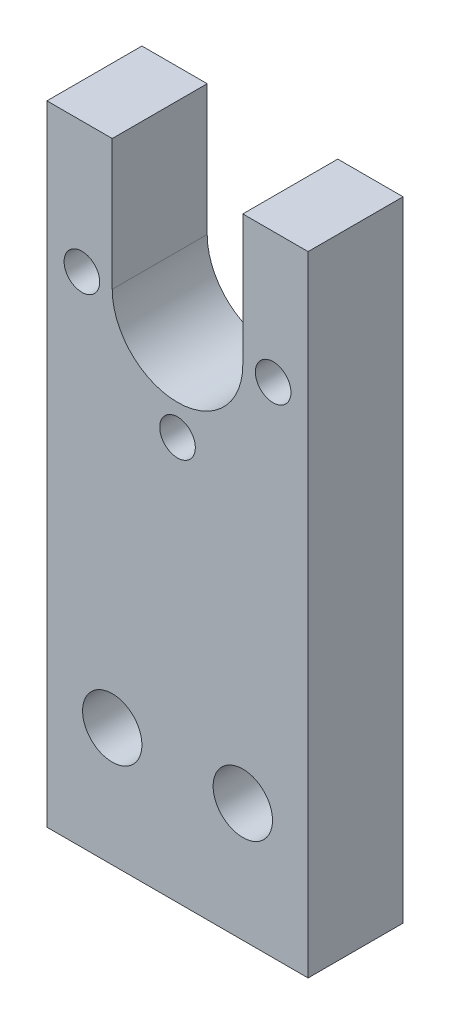
ISO-10303-21;
HEADER;
FILE_DESCRIPTION(('STEP AP214'),'2;1');
FILE_NAME('part.step','',(''),(''),'','','');
FILE_SCHEMA(('AUTOMOTIVE_DESIGN { 1 0 10303 214 1 1 1 1 }'));
ENDSEC;
DATA;
#1=APPLICATION_CONTEXT('core data for automotive mechanical design processes');
#2=APPLICATION_PROTOCOL_DEFINITION('international standard','automotive_design',2000,#1);
#3=PRODUCT_CONTEXT('',#1,'mechanical');
#4=PRODUCT('Part','Part','',(#3));
#5=PRODUCT_RELATED_PRODUCT_CATEGORY('part','',(#4));
#6=PRODUCT_DEFINITION_FORMATION('','',#4);
#7=PRODUCT_DEFINITION_CONTEXT('part definition',#1,'design');
#8=PRODUCT_DEFINITION('design','',#6,#7);
#9=PRODUCT_DEFINITION_SHAPE('','',#8);
#10=(LENGTH_UNIT() NAMED_UNIT(*) SI_UNIT(.MILLI.,.METRE.));
#11=(NAMED_UNIT(*) PLANE_ANGLE_UNIT() SI_UNIT($,.RADIAN.));
#12=(NAMED_UNIT(*) SI_UNIT($,.STERADIAN.) SOLID_ANGLE_UNIT());
#13=UNCERTAINTY_MEASURE_WITH_UNIT(LENGTH_MEASURE(1.E-05),#10,'distance_accuracy_value','');
#14=(GEOMETRIC_REPRESENTATION_CONTEXT(3) GLOBAL_UNCERTAINTY_ASSIGNED_CONTEXT((#13)) GLOBAL_UNIT_ASSIGNED_CONTEXT((#10,
#11,#12)) REPRESENTATION_CONTEXT('',''));
#15=CARTESIAN_POINT('',(0.,0.,0.));
#16=DIRECTION('',(0.,0.,1.));
#17=DIRECTION('',(1.,0.,0.));
#18=AXIS2_PLACEMENT_3D('',#15,#16,#17);
#19=CARTESIAN_POINT('',(-18.0088495575221,23.8008849557522,8.));
#20=DIRECTION('',(0.,-1.,0.));
#21=DIRECTION('',(0.,0.,-1.));
#22=AXIS2_PLACEMENT_3D('',#19,#20,#21);
#23=PLANE('',#22);
#24=DIRECTION('',(-1.,0.,0.));
#25=VECTOR('',#24,1.);
#26=CARTESIAN_POINT('',(-18.0088495575221,23.8008849557522,8.));
#27=LINE('',#26,#25);
#28=CARTESIAN_POINT('',(-12.5088495575221,23.8008849557522,8.));
#29=VERTEX_POINT('',#28);
#30=CARTESIAN_POINT('',(-18.0088495575221,23.8008849557522,8.));
#31=VERTEX_POINT('',#30);
#32=EDGE_CURVE('E136',#29,#31,#27,.T.);
#33=ORIENTED_EDGE('',*,*,#32,.F.);
#34=DIRECTION('',(0.,0.,1.));
#35=VECTOR('',#34,1.);
#36=CARTESIAN_POINT('',(-12.5088495575221,23.8008849557522,-2.));
#37=LINE('',#36,#35);
#38=CARTESIAN_POINT('',(-12.5088495575221,23.8008849557522,0.));
#39=VERTEX_POINT('',#38);
#40=EDGE_CURVE('E177',#39,#29,#37,.T.);
#41=ORIENTED_EDGE('',*,*,#40,.F.);
#42=DIRECTION('',(-1.,0.,0.));
#43=VECTOR('',#42,1.);
#44=CARTESIAN_POINT('',(-18.0088495575221,23.8008849557522,0.));
#45=LINE('',#44,#43);
#46=CARTESIAN_POINT('',(-18.0088495575221,23.8008849557522,0.));
#47=VERTEX_POINT('',#46);
#48=EDGE_CURVE('E146',#39,#47,#45,.T.);
#49=ORIENTED_EDGE('',*,*,#48,.T.);
#50=DIRECTION('',(0.,0.,-1.));
#51=VECTOR('',#50,1.);
#52=CARTESIAN_POINT('',(-18.0088495575221,23.8008849557522,8.));
#53=LINE('',#52,#51);
#54=EDGE_CURVE('E158',#31,#47,#53,.T.);
#55=ORIENTED_EDGE('',*,*,#54,.F.);
#56=EDGE_LOOP('',(#33,#41,#49,#55));
#57=FACE_BOUND('',#56,.T.);
#58=ADVANCED_FACE('F33',(#57),#23,.F.);
#59=CARTESIAN_POINT('',(0.,0.,8.));
#60=DIRECTION('',(0.,0.,1.));
#61=DIRECTION('',(1.,0.,0.));
#62=AXIS2_PLACEMENT_3D('',#59,#60,#61);
#63=PLANE('',#62);
#64=DIRECTION('',(0.,-1.,0.));
#65=VECTOR('',#64,1.);
#66=CARTESIAN_POINT('',(-12.5088495575221,12.8008849557522,8.));
#67=LINE('',#66,#65);
#68=CARTESIAN_POINT('',(-12.5088495575221,12.8008849557522,8.));
#69=VERTEX_POINT('',#68);
#70=EDGE_CURVE('E55',#29,#69,#67,.T.);
#71=ORIENTED_EDGE('',*,*,#70,.F.);
#72=ORIENTED_EDGE('',*,*,#32,.T.);
#73=DIRECTION('',(0.,-1.,0.));
#74=VECTOR('',#73,1.);
#75=CARTESIAN_POINT('',(-18.0088495575221,23.8008849557522,8.));
#76=LINE('',#75,#74);
#77=CARTESIAN_POINT('',(-18.0088495575221,-29.1991150442478,8.));
#78=VERTEX_POINT('',#77);
#79=EDGE_CURVE('E139',#31,#78,#76,.T.);
#80=ORIENTED_EDGE('',*,*,#79,.T.);
#81=DIRECTION('',(1.,0.,0.));
#82=VECTOR('',#81,1.);
#83=CARTESIAN_POINT('',(-18.0088495575221,-29.1991150442478,8.));
#84=LINE('',#83,#82);
#85=CARTESIAN_POINT('',(3.99115044247788,-29.1991150442478,8.));
#86=VERTEX_POINT('',#85);
#87=EDGE_CURVE('E141',#78,#86,#84,.T.);
#88=ORIENTED_EDGE('',*,*,#87,.T.);
#89=DIRECTION('',(0.,1.,0.));
#90=VECTOR('',#89,1.);
#91=CARTESIAN_POINT('',(3.99115044247787,23.8008849557522,8.));
#92=LINE('',#91,#90);
#93=CARTESIAN_POINT('',(3.99115044247787,23.8008849557522,8.));
#94=VERTEX_POINT('',#93);
#95=EDGE_CURVE('E134',#86,#94,#92,.T.);
#96=ORIENTED_EDGE('',*,*,#95,.T.);
#97=CARTESIAN_POINT('',(-1.50884955752212,23.8008849557522,8.));
#98=VERTEX_POINT('',#97);
#99=EDGE_CURVE('E110',#94,#98,#27,.T.);
#100=ORIENTED_EDGE('',*,*,#99,.T.);
#101=DIRECTION('',(0.,1.,0.));
#102=VECTOR('',#101,1.);
#103=CARTESIAN_POINT('',(-1.50884955752212,23.8008849557522,8.));
#104=LINE('',#103,#102);
#105=CARTESIAN_POINT('',(-1.50884955752212,12.8008849557522,8.));
#106=VERTEX_POINT('',#105);
#107=EDGE_CURVE('E96',#106,#98,#104,.T.);
#108=ORIENTED_EDGE('',*,*,#107,.F.);
#109=CARTESIAN_POINT('',(-7.00884955752212,12.8008849557522,8.));
#110=DIRECTION('',(0.,0.,1.));
#111=DIRECTION('',(1.,0.,0.));
#112=AXIS2_PLACEMENT_3D('',#109,#110,#111);
#113=CIRCLE('',#112,5.5);
#114=EDGE_CURVE('E108',#69,#106,#113,.T.);
#115=ORIENTED_EDGE('',*,*,#114,.F.);
#116=EDGE_LOOP('',(#71,#72,#80,#88,#96,#100,#108,#115));
#117=FACE_BOUND('',#116,.T.);
#118=CARTESIAN_POINT('',(-7.00884955752212,4.74282834419709,8.));
#119=DIRECTION('',(0.,0.,1.));
#120=DIRECTION('',(1.,0.,0.));
#121=AXIS2_PLACEMENT_3D('',#118,#119,#120);
#122=CIRCLE('',#121,1.5);
#123=CARTESIAN_POINT('',(-5.50884955752212,4.74282834419709,8.));
#124=VERTEX_POINT('',#123);
#125=EDGE_CURVE('E191',#124,#124,#122,.T.);
#126=ORIENTED_EDGE('',*,*,#125,.F.);
#127=EDGE_LOOP('',(#126));
#128=FACE_BOUND('',#127,.T.);
#129=CARTESIAN_POINT('',(-1.50884955752212,-19.1991150442478,8.));
#130=DIRECTION('',(0.,0.,1.));
#131=DIRECTION('',(1.,0.,0.));
#132=AXIS2_PLACEMENT_3D('',#129,#130,#131);
#133=CIRCLE('',#132,2.5);
#134=CARTESIAN_POINT('',(0.99115044247788,-19.1991150442478,8.));
#135=VERTEX_POINT('',#134);
#136=EDGE_CURVE('E117',#135,#135,#133,.T.);
#137=ORIENTED_EDGE('',*,*,#136,.F.);
#138=EDGE_LOOP('',(#137));
#139=FACE_BOUND('',#138,.T.);
#140=CARTESIAN_POINT('',(-12.5088495575221,-19.1991150442478,8.));
#141=DIRECTION('',(0.,0.,1.));
#142=DIRECTION('',(1.,0.,0.));
#143=AXIS2_PLACEMENT_3D('',#140,#141,#142);
#144=CIRCLE('',#143,2.5);
#145=CARTESIAN_POINT('',(-10.0088495575221,-19.1991150442478,8.));
#146=VERTEX_POINT('',#145);
#147=EDGE_CURVE('E128',#146,#146,#144,.T.);
#148=ORIENTED_EDGE('',*,*,#147,.F.);
#149=EDGE_LOOP('',(#148));
#150=FACE_BOUND('',#149,.T.);
#151=CARTESIAN_POINT('',(1.04920705403299,12.8008849557522,8.));
#152=DIRECTION('',(0.,0.,1.));
#153=DIRECTION('',(1.,0.,0.));
#154=AXIS2_PLACEMENT_3D('',#151,#152,#153);
#155=CIRCLE('',#154,1.5);
#156=CARTESIAN_POINT('',(2.54920705403299,12.8008849557522,8.));
#157=VERTEX_POINT('',#156);
#158=EDGE_CURVE('E119',#157,#157,#155,.T.);
#159=ORIENTED_EDGE('',*,*,#158,.F.);
#160=EDGE_LOOP('',(#159));
#161=FACE_BOUND('',#160,.T.);
#162=CARTESIAN_POINT('',(-15.0669061690772,12.8008849557522,8.));
#163=DIRECTION('',(0.,0.,1.));
#164=DIRECTION('',(1.,0.,0.));
#165=AXIS2_PLACEMENT_3D('',#162,#163,#164);
#166=CIRCLE('',#165,1.5);
#167=CARTESIAN_POINT('',(-13.5669061690772,12.8008849557522,8.));
#168=VERTEX_POINT('',#167);
#169=EDGE_CURVE('E185',#168,#168,#166,.T.);
#170=ORIENTED_EDGE('',*,*,#169,.F.);
#171=EDGE_LOOP('',(#170));
#172=FACE_BOUND('',#171,.T.);
#173=ADVANCED_FACE('F106',(#117,#128,#139,#150,#161,#172),#63,.T.);
#174=CARTESIAN_POINT('',(0.,0.,0.));
#175=DIRECTION('',(0.,0.,1.));
#176=DIRECTION('',(1.,0.,0.));
#177=AXIS2_PLACEMENT_3D('',#174,#175,#176);
#178=PLANE('',#177);
#179=CARTESIAN_POINT('',(-12.5088495575221,-19.1991150442478,0.));
#180=DIRECTION('',(0.,0.,1.));
#181=DIRECTION('',(1.,0.,0.));
#182=AXIS2_PLACEMENT_3D('',#179,#180,#181);
#183=CIRCLE('',#182,2.5);
#184=CARTESIAN_POINT('',(-10.0088495575221,-19.1991150442478,0.));
#185=VERTEX_POINT('',#184);
#186=EDGE_CURVE('E126',#185,#185,#183,.T.);
#187=ORIENTED_EDGE('',*,*,#186,.T.);
#188=EDGE_LOOP('',(#187));
#189=FACE_BOUND('',#188,.T.);
#190=CARTESIAN_POINT('',(-1.50884955752212,-19.1991150442478,0.));
#191=DIRECTION('',(0.,0.,1.));
#192=DIRECTION('',(1.,0.,0.));
#193=AXIS2_PLACEMENT_3D('',#190,#191,#192);
#194=CIRCLE('',#193,2.5);
#195=CARTESIAN_POINT('',(0.99115044247788,-19.1991150442478,0.));
#196=VERTEX_POINT('',#195);
#197=EDGE_CURVE('E113',#196,#196,#194,.T.);
#198=ORIENTED_EDGE('',*,*,#197,.T.);
#199=EDGE_LOOP('',(#198));
#200=FACE_BOUND('',#199,.T.);
#201=ORIENTED_EDGE('',*,*,#48,.F.);
#202=DIRECTION('',(0.,-1.,0.));
#203=VECTOR('',#202,1.);
#204=CARTESIAN_POINT('',(-12.5088495575221,0.,0.));
#205=LINE('',#204,#203);
#206=CARTESIAN_POINT('',(-12.5088495575221,12.8008849557522,0.));
#207=VERTEX_POINT('',#206);
#208=EDGE_CURVE('E176',#39,#207,#205,.T.);
#209=ORIENTED_EDGE('',*,*,#208,.T.);
#210=CARTESIAN_POINT('',(-7.00884955752212,12.8008849557522,0.));
#211=DIRECTION('',(0.,0.,1.));
#212=DIRECTION('',(1.,0.,0.));
#213=AXIS2_PLACEMENT_3D('',#210,#211,#212);
#214=CIRCLE('',#213,5.5);
#215=CARTESIAN_POINT('',(-1.50884955752212,12.8008849557522,0.));
#216=VERTEX_POINT('',#215);
#217=EDGE_CURVE('E114',#207,#216,#214,.T.);
#218=ORIENTED_EDGE('',*,*,#217,.T.);
#219=DIRECTION('',(0.,1.,0.));
#220=VECTOR('',#219,1.);
#221=CARTESIAN_POINT('',(-1.50884955752212,0.,0.));
#222=LINE('',#221,#220);
#223=CARTESIAN_POINT('',(-1.50884955752212,23.8008849557522,0.));
#224=VERTEX_POINT('',#223);
#225=EDGE_CURVE('E48',#216,#224,#222,.T.);
#226=ORIENTED_EDGE('',*,*,#225,.T.);
#227=CARTESIAN_POINT('',(3.99115044247787,23.8008849557522,0.));
#228=VERTEX_POINT('',#227);
#229=EDGE_CURVE('E147',#228,#224,#45,.T.);
#230=ORIENTED_EDGE('',*,*,#229,.F.);
#231=DIRECTION('',(0.,1.,0.));
#232=VECTOR('',#231,1.);
#233=CARTESIAN_POINT('',(3.99115044247787,23.8008849557522,0.));
#234=LINE('',#233,#232);
#235=CARTESIAN_POINT('',(3.99115044247788,-29.1991150442478,0.));
#236=VERTEX_POINT('',#235);
#237=EDGE_CURVE('E131',#236,#228,#234,.T.);
#238=ORIENTED_EDGE('',*,*,#237,.F.);
#239=DIRECTION('',(1.,0.,0.));
#240=VECTOR('',#239,1.);
#241=CARTESIAN_POINT('',(-18.0088495575221,-29.1991150442478,0.));
#242=LINE('',#241,#240);
#243=CARTESIAN_POINT('',(-18.0088495575221,-29.1991150442478,0.));
#244=VERTEX_POINT('',#243);
#245=EDGE_CURVE('E137',#244,#236,#242,.T.);
#246=ORIENTED_EDGE('',*,*,#245,.F.);
#247=DIRECTION('',(0.,-1.,0.));
#248=VECTOR('',#247,1.);
#249=CARTESIAN_POINT('',(-18.0088495575221,23.8008849557522,0.));
#250=LINE('',#249,#248);
#251=EDGE_CURVE('E150',#47,#244,#250,.T.);
#252=ORIENTED_EDGE('',*,*,#251,.F.);
#253=EDGE_LOOP('',(#201,#209,#218,#226,#230,#238,#246,#252));
#254=FACE_BOUND('',#253,.T.);
#255=CARTESIAN_POINT('',(1.04920705403299,12.8008849557522,0.));
#256=DIRECTION('',(0.,0.,1.));
#257=DIRECTION('',(1.,0.,0.));
#258=AXIS2_PLACEMENT_3D('',#255,#256,#257);
#259=CIRCLE('',#258,1.5);
#260=CARTESIAN_POINT('',(2.54920705403299,12.8008849557522,0.));
#261=VERTEX_POINT('',#260);
#262=EDGE_CURVE('E122',#261,#261,#259,.T.);
#263=ORIENTED_EDGE('',*,*,#262,.T.);
#264=EDGE_LOOP('',(#263));
#265=FACE_BOUND('',#264,.T.);
#266=CARTESIAN_POINT('',(-7.00884955752212,4.74282834419709,0.));
#267=DIRECTION('',(0.,0.,1.));
#268=DIRECTION('',(1.,0.,0.));
#269=AXIS2_PLACEMENT_3D('',#266,#267,#268);
#270=CIRCLE('',#269,1.5);
#271=CARTESIAN_POINT('',(-5.50884955752212,4.74282834419709,0.));
#272=VERTEX_POINT('',#271);
#273=EDGE_CURVE('E188',#272,#272,#270,.T.);
#274=ORIENTED_EDGE('',*,*,#273,.T.);
#275=EDGE_LOOP('',(#274));
#276=FACE_BOUND('',#275,.T.);
#277=CARTESIAN_POINT('',(-15.0669061690772,12.8008849557522,0.));
#278=DIRECTION('',(0.,0.,1.));
#279=DIRECTION('',(1.,0.,0.));
#280=AXIS2_PLACEMENT_3D('',#277,#278,#279);
#281=CIRCLE('',#280,1.5);
#282=CARTESIAN_POINT('',(-13.5669061690772,12.8008849557522,0.));
#283=VERTEX_POINT('',#282);
#284=EDGE_CURVE('E179',#283,#283,#281,.T.);
#285=ORIENTED_EDGE('',*,*,#284,.T.);
#286=EDGE_LOOP('',(#285));
#287=FACE_BOUND('',#286,.T.);
#288=ADVANCED_FACE('F172',(#189,#200,#254,#265,#276,#287),#178,.F.);
#289=CARTESIAN_POINT('',(3.99115044247787,23.8008849557522,8.));
#290=DIRECTION('',(-1.,0.,0.));
#291=DIRECTION('',(0.,-1.,0.));
#292=AXIS2_PLACEMENT_3D('',#289,#290,#291);
#293=PLANE('',#292);
#294=ORIENTED_EDGE('',*,*,#237,.T.);
#295=DIRECTION('',(0.,0.,-1.));
#296=VECTOR('',#295,1.);
#297=CARTESIAN_POINT('',(3.99115044247787,23.8008849557522,8.));
#298=LINE('',#297,#296);
#299=EDGE_CURVE('E102',#94,#228,#298,.T.);
#300=ORIENTED_EDGE('',*,*,#299,.F.);
#301=ORIENTED_EDGE('',*,*,#95,.F.);
#302=DIRECTION('',(0.,0.,-1.));
#303=VECTOR('',#302,1.);
#304=CARTESIAN_POINT('',(3.99115044247788,-29.1991150442478,8.));
#305=LINE('',#304,#303);
#306=EDGE_CURVE('E143',#86,#236,#305,.T.);
#307=ORIENTED_EDGE('',*,*,#306,.T.);
#308=EDGE_LOOP('',(#294,#300,#301,#307));
#309=FACE_BOUND('',#308,.T.);
#310=ADVANCED_FACE('F35',(#309),#293,.F.);
#311=ORIENTED_EDGE('',*,*,#229,.T.);
#312=DIRECTION('',(0.,0.,1.));
#313=VECTOR('',#312,1.);
#314=CARTESIAN_POINT('',(-1.50884955752212,23.8008849557522,-2.));
#315=LINE('',#314,#313);
#316=EDGE_CURVE('E181',#224,#98,#315,.T.);
#317=ORIENTED_EDGE('',*,*,#316,.T.);
#318=ORIENTED_EDGE('',*,*,#99,.F.);
#319=ORIENTED_EDGE('',*,*,#299,.T.);
#320=EDGE_LOOP('',(#311,#317,#318,#319));
#321=FACE_BOUND('',#320,.T.);
#322=ADVANCED_FACE('F164',(#321),#23,.F.);
#323=CARTESIAN_POINT('',(-18.0088495575221,23.8008849557522,8.));
#324=DIRECTION('',(1.,0.,0.));
#325=DIRECTION('',(0.,1.,0.));
#326=AXIS2_PLACEMENT_3D('',#323,#324,#325);
#327=PLANE('',#326);
#328=ORIENTED_EDGE('',*,*,#251,.T.);
#329=DIRECTION('',(0.,0.,-1.));
#330=VECTOR('',#329,1.);
#331=CARTESIAN_POINT('',(-18.0088495575221,-29.1991150442478,8.));
#332=LINE('',#331,#330);
#333=EDGE_CURVE('E155',#78,#244,#332,.T.);
#334=ORIENTED_EDGE('',*,*,#333,.F.);
#335=ORIENTED_EDGE('',*,*,#79,.F.);
#336=ORIENTED_EDGE('',*,*,#54,.T.);
#337=EDGE_LOOP('',(#328,#334,#335,#336));
#338=FACE_BOUND('',#337,.T.);
#339=ADVANCED_FACE('F226',(#338),#327,.F.);
#340=CARTESIAN_POINT('',(-18.0088495575221,-29.1991150442478,8.));
#341=DIRECTION('',(0.,1.,0.));
#342=DIRECTION('',(0.,0.,1.));
#343=AXIS2_PLACEMENT_3D('',#340,#341,#342);
#344=PLANE('',#343);
#345=ORIENTED_EDGE('',*,*,#245,.T.);
#346=ORIENTED_EDGE('',*,*,#306,.F.);
#347=ORIENTED_EDGE('',*,*,#87,.F.);
#348=ORIENTED_EDGE('',*,*,#333,.T.);
#349=EDGE_LOOP('',(#345,#346,#347,#348));
#350=FACE_BOUND('',#349,.T.);
#351=ADVANCED_FACE('F231',(#350),#344,.F.);
#352=CARTESIAN_POINT('',(-12.5088495575221,-19.1991150442478,8.));
#353=DIRECTION('',(0.,0.,-1.));
#354=DIRECTION('',(-1.,0.,0.));
#355=AXIS2_PLACEMENT_3D('',#352,#353,#354);
#356=CYLINDRICAL_SURFACE('',#355,2.5);
#357=ORIENTED_EDGE('',*,*,#147,.T.);
#358=EDGE_LOOP('',(#357));
#359=FACE_BOUND('',#358,.T.);
#360=ORIENTED_EDGE('',*,*,#186,.F.);
#361=EDGE_LOOP('',(#360));
#362=FACE_BOUND('',#361,.T.);
#363=ADVANCED_FACE('F244',(#359,#362),#356,.F.);
#364=CARTESIAN_POINT('',(-1.50884955752212,-19.1991150442478,8.));
#365=DIRECTION('',(0.,0.,-1.));
#366=DIRECTION('',(-1.,0.,0.));
#367=AXIS2_PLACEMENT_3D('',#364,#365,#366);
#368=CYLINDRICAL_SURFACE('',#367,2.5);
#369=ORIENTED_EDGE('',*,*,#136,.T.);
#370=EDGE_LOOP('',(#369));
#371=FACE_BOUND('',#370,.T.);
#372=ORIENTED_EDGE('',*,*,#197,.F.);
#373=EDGE_LOOP('',(#372));
#374=FACE_BOUND('',#373,.T.);
#375=ADVANCED_FACE('F214',(#371,#374),#368,.F.);
#376=CARTESIAN_POINT('',(-7.00884955752212,12.8008849557522,8.));
#377=DIRECTION('',(0.,0.,-1.));
#378=DIRECTION('',(-1.,0.,0.));
#379=AXIS2_PLACEMENT_3D('',#376,#377,#378);
#380=CYLINDRICAL_SURFACE('',#379,5.5);
#381=DIRECTION('',(0.,0.,-1.));
#382=VECTOR('',#381,1.);
#383=CARTESIAN_POINT('',(-12.5088495575221,12.8008849557522,8.));
#384=LINE('',#383,#382);
#385=EDGE_CURVE('E11',#69,#207,#384,.T.);
#386=ORIENTED_EDGE('',*,*,#385,.F.);
#387=ORIENTED_EDGE('',*,*,#114,.T.);
#388=DIRECTION('',(0.,0.,-1.));
#389=VECTOR('',#388,1.);
#390=CARTESIAN_POINT('',(-1.50884955752212,12.8008849557522,8.));
#391=LINE('',#390,#389);
#392=EDGE_CURVE('E41',#106,#216,#391,.T.);
#393=ORIENTED_EDGE('',*,*,#392,.T.);
#394=ORIENTED_EDGE('',*,*,#217,.F.);
#395=EDGE_LOOP('',(#386,#387,#393,#394));
#396=FACE_BOUND('',#395,.T.);
#397=ADVANCED_FACE('F112',(#396),#380,.F.);
#398=CARTESIAN_POINT('',(1.04920705403299,12.8008849557522,8.));
#399=DIRECTION('',(0.,0.,-1.));
#400=DIRECTION('',(-1.,0.,0.));
#401=AXIS2_PLACEMENT_3D('',#398,#399,#400);
#402=CYLINDRICAL_SURFACE('',#401,1.5);
#403=ORIENTED_EDGE('',*,*,#158,.T.);
#404=EDGE_LOOP('',(#403));
#405=FACE_BOUND('',#404,.T.);
#406=ORIENTED_EDGE('',*,*,#262,.F.);
#407=EDGE_LOOP('',(#406));
#408=FACE_BOUND('',#407,.T.);
#409=ADVANCED_FACE('F202',(#405,#408),#402,.F.);
#410=CARTESIAN_POINT('',(-7.00884955752212,4.74282834419709,8.));
#411=DIRECTION('',(0.,0.,-1.));
#412=DIRECTION('',(-1.,0.,0.));
#413=AXIS2_PLACEMENT_3D('',#410,#411,#412);
#414=CYLINDRICAL_SURFACE('',#413,1.5);
#415=ORIENTED_EDGE('',*,*,#125,.T.);
#416=EDGE_LOOP('',(#415));
#417=FACE_BOUND('',#416,.T.);
#418=ORIENTED_EDGE('',*,*,#273,.F.);
#419=EDGE_LOOP('',(#418));
#420=FACE_BOUND('',#419,.T.);
#421=ADVANCED_FACE('F204',(#417,#420),#414,.F.);
#422=CARTESIAN_POINT('',(-15.0669061690772,12.8008849557522,8.));
#423=DIRECTION('',(0.,0.,-1.));
#424=DIRECTION('',(-1.,0.,0.));
#425=AXIS2_PLACEMENT_3D('',#422,#423,#424);
#426=CYLINDRICAL_SURFACE('',#425,1.5);
#427=ORIENTED_EDGE('',*,*,#169,.T.);
#428=EDGE_LOOP('',(#427));
#429=FACE_BOUND('',#428,.T.);
#430=ORIENTED_EDGE('',*,*,#284,.F.);
#431=EDGE_LOOP('',(#430));
#432=FACE_BOUND('',#431,.T.);
#433=ADVANCED_FACE('F210',(#429,#432),#426,.F.);
#434=CARTESIAN_POINT('',(-1.50884955752212,23.8008849557522,-2.));
#435=DIRECTION('',(1.,0.,0.));
#436=DIRECTION('',(0.,0.,-1.));
#437=AXIS2_PLACEMENT_3D('',#434,#435,#436);
#438=PLANE('',#437);
#439=ORIENTED_EDGE('',*,*,#392,.F.);
#440=ORIENTED_EDGE('',*,*,#107,.T.);
#441=ORIENTED_EDGE('',*,*,#316,.F.);
#442=ORIENTED_EDGE('',*,*,#225,.F.);
#443=EDGE_LOOP('',(#439,#440,#441,#442));
#444=FACE_BOUND('',#443,.T.);
#445=ADVANCED_FACE('F95',(#444),#438,.F.);
#446=CARTESIAN_POINT('',(-12.5088495575221,12.8008849557522,-2.));
#447=DIRECTION('',(-1.,0.,0.));
#448=DIRECTION('',(0.,0.,1.));
#449=AXIS2_PLACEMENT_3D('',#446,#447,#448);
#450=PLANE('',#449);
#451=ORIENTED_EDGE('',*,*,#40,.T.);
#452=ORIENTED_EDGE('',*,*,#70,.T.);
#453=ORIENTED_EDGE('',*,*,#385,.T.);
#454=ORIENTED_EDGE('',*,*,#208,.F.);
#455=EDGE_LOOP('',(#451,#452,#453,#454));
#456=FACE_BOUND('',#455,.T.);
#457=ADVANCED_FACE('F255',(#456),#450,.F.);
#458=CLOSED_SHELL('',(#58,#173,#288,#310,#322,#339,#351,#363,#375,#397,#409,#421,#433,#445,#457));
#459=MANIFOLD_SOLID_BREP('B2',#458);
#460=ADVANCED_BREP_SHAPE_REPRESENTATION('',(#18,#459),#14);
#461=SHAPE_DEFINITION_REPRESENTATION(#9,#460);
ENDSEC;
END-ISO-10303-21;
